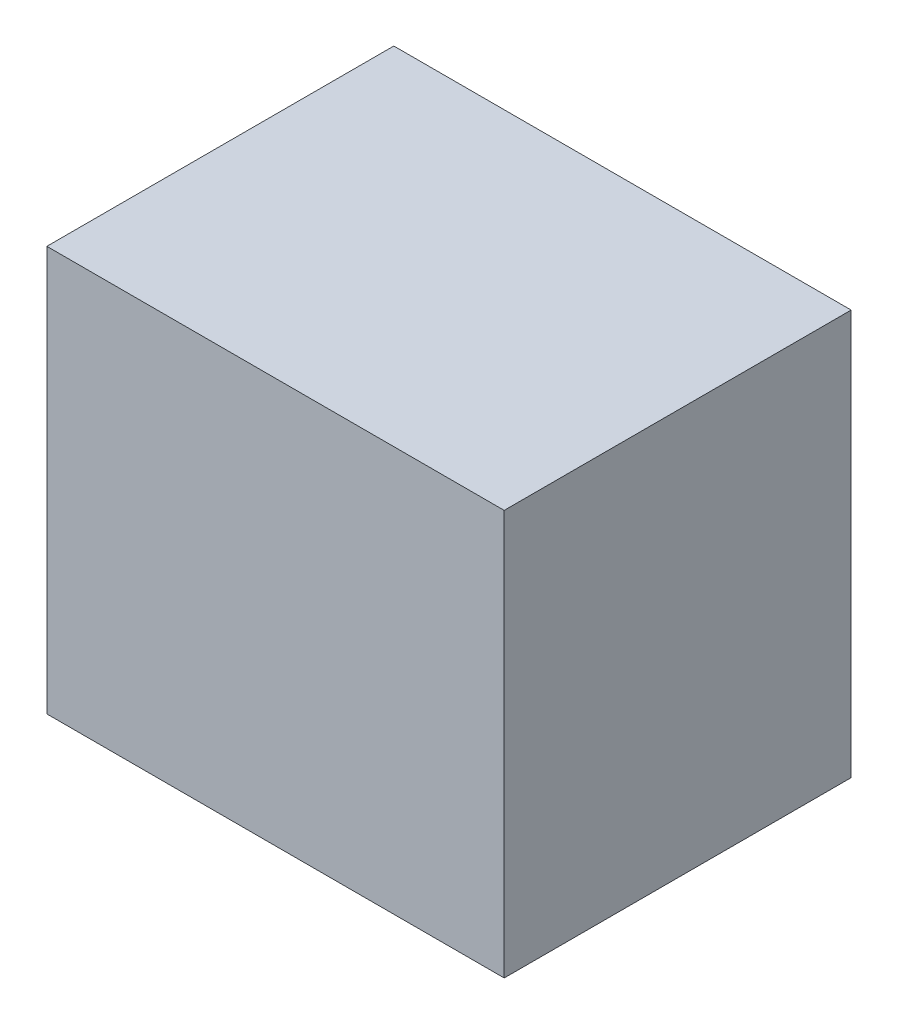
ISO-10303-21;
HEADER;
FILE_DESCRIPTION(('STEP AP214'),'2;1');
FILE_NAME('part.step','',(''),(''),'','','');
FILE_SCHEMA(('AUTOMOTIVE_DESIGN { 1 0 10303 214 1 1 1 1 }'));
ENDSEC;
DATA;
#1=APPLICATION_CONTEXT('core data for automotive mechanical design processes');
#2=APPLICATION_PROTOCOL_DEFINITION('international standard','automotive_design',2000,#1);
#3=PRODUCT_CONTEXT('',#1,'mechanical');
#4=PRODUCT('Part','Part','',(#3));
#5=PRODUCT_RELATED_PRODUCT_CATEGORY('part','',(#4));
#6=PRODUCT_DEFINITION_FORMATION('','',#4);
#7=PRODUCT_DEFINITION_CONTEXT('part definition',#1,'design');
#8=PRODUCT_DEFINITION('design','',#6,#7);
#9=PRODUCT_DEFINITION_SHAPE('','',#8);
#10=(LENGTH_UNIT() NAMED_UNIT(*) SI_UNIT(.MILLI.,.METRE.));
#11=(NAMED_UNIT(*) PLANE_ANGLE_UNIT() SI_UNIT($,.RADIAN.));
#12=(NAMED_UNIT(*) SI_UNIT($,.STERADIAN.) SOLID_ANGLE_UNIT());
#13=UNCERTAINTY_MEASURE_WITH_UNIT(LENGTH_MEASURE(1.E-05),#10,'distance_accuracy_value','');
#14=(GEOMETRIC_REPRESENTATION_CONTEXT(3) GLOBAL_UNCERTAINTY_ASSIGNED_CONTEXT((#13)) GLOBAL_UNIT_ASSIGNED_CONTEXT((#10,
#11,#12)) REPRESENTATION_CONTEXT('',''));
#15=CARTESIAN_POINT('',(0.,0.,0.));
#16=DIRECTION('',(0.,0.,1.));
#17=DIRECTION('',(1.,0.,0.));
#18=AXIS2_PLACEMENT_3D('',#15,#16,#17);
#19=CARTESIAN_POINT('',(0.72499982,0.64200024,1.10000034));
#20=DIRECTION('',(0.,0.,-1.));
#21=DIRECTION('',(-1.,0.,0.));
#22=AXIS2_PLACEMENT_3D('',#19,#20,#21);
#23=PLANE('',#22);
#24=DIRECTION('',(0.,1.,0.));
#25=VECTOR('',#24,1.);
#26=CARTESIAN_POINT('',(-0.72499982,0.64200024,1.10000034));
#27=LINE('',#26,#25);
#28=CARTESIAN_POINT('',(-0.72499982,0.64200024,1.10000034));
#29=VERTEX_POINT('',#28);
#30=CARTESIAN_POINT('',(-0.72499982,-0.64200024,1.10000034));
#31=VERTEX_POINT('',#30);
#32=EDGE_CURVE('E55',#29,#31,#27,.F.);
#33=ORIENTED_EDGE('',*,*,#32,.T.);
#34=DIRECTION('',(1.,0.,0.));
#35=VECTOR('',#34,1.);
#36=CARTESIAN_POINT('',(-0.72499982,-0.64200024,1.10000034));
#37=LINE('',#36,#35);
#38=CARTESIAN_POINT('',(0.72499982,-0.64200024,1.10000034));
#39=VERTEX_POINT('',#38);
#40=EDGE_CURVE('E57',#31,#39,#37,.T.);
#41=ORIENTED_EDGE('',*,*,#40,.T.);
#42=DIRECTION('',(0.,1.,0.));
#43=VECTOR('',#42,1.);
#44=CARTESIAN_POINT('',(0.72499982,-0.64200024,1.10000034));
#45=LINE('',#44,#43);
#46=CARTESIAN_POINT('',(0.72499982,0.64200024,1.10000034));
#47=VERTEX_POINT('',#46);
#48=EDGE_CURVE('E20',#39,#47,#45,.T.);
#49=ORIENTED_EDGE('',*,*,#48,.T.);
#50=DIRECTION('',(1.,0.,0.));
#51=VECTOR('',#50,1.);
#52=CARTESIAN_POINT('',(0.72499982,0.64200024,1.10000034));
#53=LINE('',#52,#51);
#54=EDGE_CURVE('E80',#47,#29,#53,.F.);
#55=ORIENTED_EDGE('',*,*,#54,.T.);
#56=EDGE_LOOP('',(#33,#41,#49,#55));
#57=FACE_BOUND('',#56,.T.);
#58=ADVANCED_FACE('F17',(#57),#23,.F.);
#59=CARTESIAN_POINT('',(0.72499982,-0.64200024,0.));
#60=DIRECTION('',(-1.,0.,0.));
#61=DIRECTION('',(0.,0.,1.));
#62=AXIS2_PLACEMENT_3D('',#59,#60,#61);
#63=PLANE('',#62);
#64=DIRECTION('',(0.,0.,-1.));
#65=VECTOR('',#64,1.);
#66=CARTESIAN_POINT('',(0.72499982,0.64200024,0.));
#67=LINE('',#66,#65);
#68=CARTESIAN_POINT('',(0.72499982,0.64200024,0.));
#69=VERTEX_POINT('',#68);
#70=EDGE_CURVE('E68',#69,#47,#67,.F.);
#71=ORIENTED_EDGE('',*,*,#70,.T.);
#72=ORIENTED_EDGE('',*,*,#48,.F.);
#73=DIRECTION('',(0.,0.,1.));
#74=VECTOR('',#73,1.);
#75=CARTESIAN_POINT('',(0.72499982,-0.64200024,0.));
#76=LINE('',#75,#74);
#77=CARTESIAN_POINT('',(0.72499982,-0.64200024,0.));
#78=VERTEX_POINT('',#77);
#79=EDGE_CURVE('E63',#39,#78,#76,.F.);
#80=ORIENTED_EDGE('',*,*,#79,.T.);
#81=DIRECTION('',(0.,1.,0.));
#82=VECTOR('',#81,1.);
#83=CARTESIAN_POINT('',(0.72499982,0.64200024,0.));
#84=LINE('',#83,#82);
#85=EDGE_CURVE('E83',#69,#78,#84,.F.);
#86=ORIENTED_EDGE('',*,*,#85,.F.);
#87=EDGE_LOOP('',(#71,#72,#80,#86));
#88=FACE_BOUND('',#87,.T.);
#89=ADVANCED_FACE('F65',(#88),#63,.F.);
#90=CARTESIAN_POINT('',(-0.72499982,-0.64200024,0.));
#91=DIRECTION('',(0.,1.,0.));
#92=DIRECTION('',(0.,0.,1.));
#93=AXIS2_PLACEMENT_3D('',#90,#91,#92);
#94=PLANE('',#93);
#95=ORIENTED_EDGE('',*,*,#79,.F.);
#96=ORIENTED_EDGE('',*,*,#40,.F.);
#97=DIRECTION('',(0.,0.,-1.));
#98=VECTOR('',#97,1.);
#99=CARTESIAN_POINT('',(-0.72499982,-0.64200024,0.));
#100=LINE('',#99,#98);
#101=CARTESIAN_POINT('',(-0.72499982,-0.64200024,0.));
#102=VERTEX_POINT('',#101);
#103=EDGE_CURVE('E75',#31,#102,#100,.T.);
#104=ORIENTED_EDGE('',*,*,#103,.T.);
#105=DIRECTION('',(-1.,0.,0.));
#106=VECTOR('',#105,1.);
#107=CARTESIAN_POINT('',(0.72499982,-0.64200024,0.));
#108=LINE('',#107,#106);
#109=EDGE_CURVE('E72',#78,#102,#108,.T.);
#110=ORIENTED_EDGE('',*,*,#109,.F.);
#111=EDGE_LOOP('',(#95,#96,#104,#110));
#112=FACE_BOUND('',#111,.T.);
#113=ADVANCED_FACE('F70',(#112),#94,.F.);
#114=CARTESIAN_POINT('',(-0.72499982,0.64200024,0.));
#115=DIRECTION('',(1.,0.,0.));
#116=DIRECTION('',(0.,0.,-1.));
#117=AXIS2_PLACEMENT_3D('',#114,#115,#116);
#118=PLANE('',#117);
#119=ORIENTED_EDGE('',*,*,#103,.F.);
#120=ORIENTED_EDGE('',*,*,#32,.F.);
#121=DIRECTION('',(0.,0.,-1.));
#122=VECTOR('',#121,1.);
#123=CARTESIAN_POINT('',(-0.72499982,0.64200024,0.));
#124=LINE('',#123,#122);
#125=CARTESIAN_POINT('',(-0.72499982,0.64200024,0.));
#126=VERTEX_POINT('',#125);
#127=EDGE_CURVE('E35',#29,#126,#124,.T.);
#128=ORIENTED_EDGE('',*,*,#127,.T.);
#129=DIRECTION('',(0.,1.,0.));
#130=VECTOR('',#129,1.);
#131=CARTESIAN_POINT('',(-0.72499982,0.64200024,0.));
#132=LINE('',#131,#130);
#133=EDGE_CURVE('E26',#102,#126,#132,.T.);
#134=ORIENTED_EDGE('',*,*,#133,.F.);
#135=EDGE_LOOP('',(#119,#120,#128,#134));
#136=FACE_BOUND('',#135,.T.);
#137=ADVANCED_FACE('F89',(#136),#118,.F.);
#138=CARTESIAN_POINT('',(0.72499982,0.64200024,0.));
#139=DIRECTION('',(0.,-1.,0.));
#140=DIRECTION('',(0.,0.,-1.));
#141=AXIS2_PLACEMENT_3D('',#138,#139,#140);
#142=PLANE('',#141);
#143=ORIENTED_EDGE('',*,*,#127,.F.);
#144=ORIENTED_EDGE('',*,*,#54,.F.);
#145=ORIENTED_EDGE('',*,*,#70,.F.);
#146=DIRECTION('',(-1.,0.,0.));
#147=VECTOR('',#146,1.);
#148=CARTESIAN_POINT('',(0.72499982,0.64200024,0.));
#149=LINE('',#148,#147);
#150=EDGE_CURVE('E11',#126,#69,#149,.F.);
#151=ORIENTED_EDGE('',*,*,#150,.F.);
#152=EDGE_LOOP('',(#143,#144,#145,#151));
#153=FACE_BOUND('',#152,.T.);
#154=ADVANCED_FACE('F91',(#153),#142,.F.);
#155=CARTESIAN_POINT('',(0.72499982,0.64200024,0.));
#156=DIRECTION('',(0.,0.,-1.));
#157=DIRECTION('',(-1.,0.,0.));
#158=AXIS2_PLACEMENT_3D('',#155,#156,#157);
#159=PLANE('',#158);
#160=ORIENTED_EDGE('',*,*,#133,.T.);
#161=ORIENTED_EDGE('',*,*,#150,.T.);
#162=ORIENTED_EDGE('',*,*,#85,.T.);
#163=ORIENTED_EDGE('',*,*,#109,.T.);
#164=EDGE_LOOP('',(#160,#161,#162,#163));
#165=FACE_BOUND('',#164,.T.);
#166=ADVANCED_FACE('F88',(#165),#159,.T.);
#167=CLOSED_SHELL('',(#58,#89,#113,#137,#154,#166));
#168=MANIFOLD_SOLID_BREP('B1',#167);
#169=ADVANCED_BREP_SHAPE_REPRESENTATION('',(#18,#168),#14);
#170=SHAPE_DEFINITION_REPRESENTATION(#9,#169);
ENDSEC;
END-ISO-10303-21;
